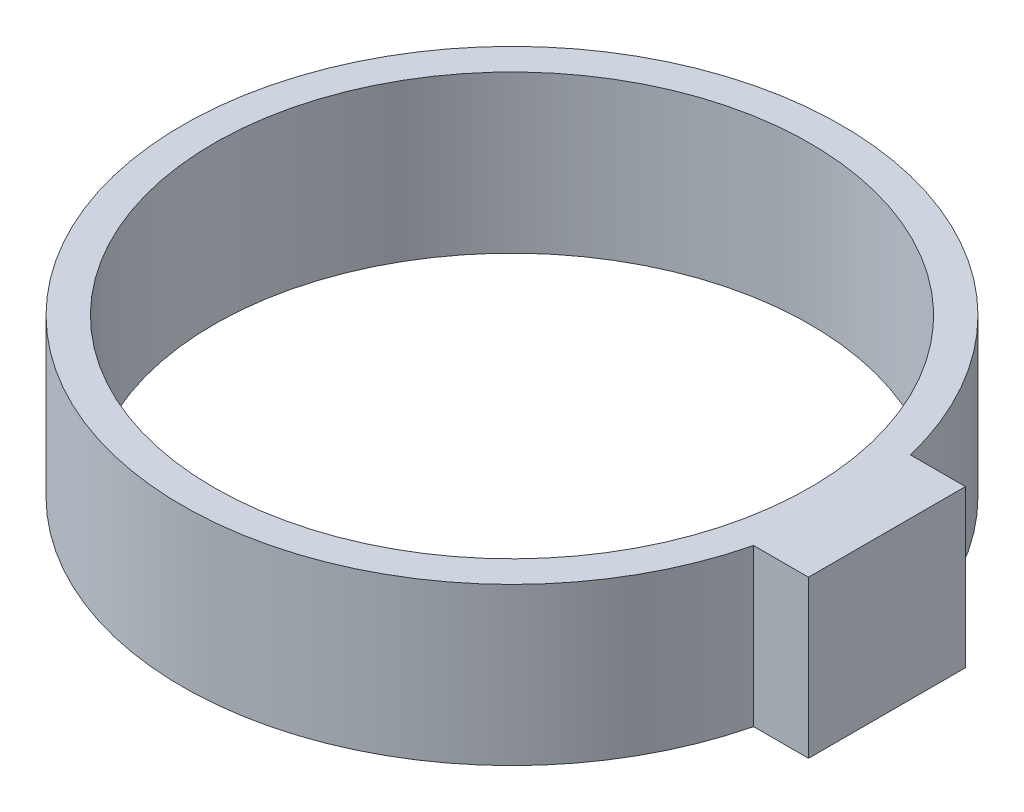
ISO-10303-21;
HEADER;
FILE_DESCRIPTION(('STEP AP214'),'2;1');
FILE_NAME('part.step','',(''),(''),'','','');
FILE_SCHEMA(('AUTOMOTIVE_DESIGN { 1 0 10303 214 1 1 1 1 }'));
ENDSEC;
DATA;
#1=APPLICATION_CONTEXT('core data for automotive mechanical design processes');
#2=APPLICATION_PROTOCOL_DEFINITION('international standard','automotive_design',2000,#1);
#3=PRODUCT_CONTEXT('',#1,'mechanical');
#4=PRODUCT('Part','Part','',(#3));
#5=PRODUCT_RELATED_PRODUCT_CATEGORY('part','',(#4));
#6=PRODUCT_DEFINITION_FORMATION('','',#4);
#7=PRODUCT_DEFINITION_CONTEXT('part definition',#1,'design');
#8=PRODUCT_DEFINITION('design','',#6,#7);
#9=PRODUCT_DEFINITION_SHAPE('','',#8);
#10=(LENGTH_UNIT() NAMED_UNIT(*) SI_UNIT(.MILLI.,.METRE.));
#11=(NAMED_UNIT(*) PLANE_ANGLE_UNIT() SI_UNIT($,.RADIAN.));
#12=(NAMED_UNIT(*) SI_UNIT($,.STERADIAN.) SOLID_ANGLE_UNIT());
#13=UNCERTAINTY_MEASURE_WITH_UNIT(LENGTH_MEASURE(1.E-05),#10,'distance_accuracy_value','');
#14=(GEOMETRIC_REPRESENTATION_CONTEXT(3) GLOBAL_UNCERTAINTY_ASSIGNED_CONTEXT((#13)) GLOBAL_UNIT_ASSIGNED_CONTEXT((#10,
#11,#12)) REPRESENTATION_CONTEXT('',''));
#15=CARTESIAN_POINT('',(0.,0.,0.));
#16=DIRECTION('',(0.,0.,1.));
#17=DIRECTION('',(1.,0.,0.));
#18=AXIS2_PLACEMENT_3D('',#15,#16,#17);
#19=CARTESIAN_POINT('',(0.,10.,0.));
#20=DIRECTION('',(0.,1.,0.));
#21=DIRECTION('',(0.,0.,1.));
#22=AXIS2_PLACEMENT_3D('',#19,#20,#21);
#23=PLANE('',#22);
#24=DIRECTION('',(0.,0.,-1.));
#25=VECTOR('',#24,1.);
#26=CARTESIAN_POINT('',(23.8960780543711,10.,-5.));
#27=LINE('',#26,#25);
#28=CARTESIAN_POINT('',(23.8960780543711,10.,5.));
#29=VERTEX_POINT('',#28);
#30=CARTESIAN_POINT('',(23.8960780543711,10.,-5.));
#31=VERTEX_POINT('',#30);
#32=EDGE_CURVE('E92',#29,#31,#27,.T.);
#33=ORIENTED_EDGE('',*,*,#32,.T.);
#34=DIRECTION('',(-1.,0.,0.));
#35=VECTOR('',#34,1.);
#36=CARTESIAN_POINT('',(20.3960780543711,10.,-5.));
#37=LINE('',#36,#35);
#38=CARTESIAN_POINT('',(20.3960780543711,10.,-5.));
#39=VERTEX_POINT('',#38);
#40=EDGE_CURVE('E87',#31,#39,#37,.T.);
#41=ORIENTED_EDGE('',*,*,#40,.T.);
#42=CARTESIAN_POINT('',(0.,10.,0.));
#43=DIRECTION('',(0.,1.,0.));
#44=DIRECTION('',(0.,0.,1.));
#45=AXIS2_PLACEMENT_3D('',#42,#43,#44);
#46=CIRCLE('',#45,21.);
#47=CARTESIAN_POINT('',(20.3960780543711,10.,5.));
#48=VERTEX_POINT('',#47);
#49=EDGE_CURVE('E90',#39,#48,#46,.T.);
#50=ORIENTED_EDGE('',*,*,#49,.T.);
#51=DIRECTION('',(1.,0.,0.));
#52=VECTOR('',#51,1.);
#53=CARTESIAN_POINT('',(23.8960780543711,10.,5.));
#54=LINE('',#53,#52);
#55=EDGE_CURVE('E57',#48,#29,#54,.T.);
#56=ORIENTED_EDGE('',*,*,#55,.T.);
#57=EDGE_LOOP('',(#33,#41,#50,#56));
#58=FACE_BOUND('',#57,.T.);
#59=CARTESIAN_POINT('',(0.,10.,0.));
#60=DIRECTION('',(0.,1.,0.));
#61=DIRECTION('',(0.,0.,1.));
#62=AXIS2_PLACEMENT_3D('',#59,#60,#61);
#63=CIRCLE('',#62,19.);
#64=CARTESIAN_POINT('',(0.,10.,19.));
#65=VERTEX_POINT('',#64);
#66=EDGE_CURVE('E112',#65,#65,#63,.T.);
#67=ORIENTED_EDGE('',*,*,#66,.F.);
#68=EDGE_LOOP('',(#67));
#69=FACE_BOUND('',#68,.T.);
#70=ADVANCED_FACE('F39',(#58,#69),#23,.T.);
#71=CARTESIAN_POINT('',(0.,0.,0.));
#72=DIRECTION('',(0.,1.,0.));
#73=DIRECTION('',(0.,0.,1.));
#74=AXIS2_PLACEMENT_3D('',#71,#72,#73);
#75=PLANE('',#74);
#76=DIRECTION('',(0.,0.,-1.));
#77=VECTOR('',#76,1.);
#78=CARTESIAN_POINT('',(23.8960780543711,0.,-5.));
#79=LINE('',#78,#77);
#80=CARTESIAN_POINT('',(23.8960780543711,0.,5.));
#81=VERTEX_POINT('',#80);
#82=CARTESIAN_POINT('',(23.8960780543711,0.,-5.));
#83=VERTEX_POINT('',#82);
#84=EDGE_CURVE('E108',#81,#83,#79,.T.);
#85=ORIENTED_EDGE('',*,*,#84,.F.);
#86=DIRECTION('',(1.,0.,0.));
#87=VECTOR('',#86,1.);
#88=CARTESIAN_POINT('',(23.8960780543711,0.,5.));
#89=LINE('',#88,#87);
#90=CARTESIAN_POINT('',(20.3960780543711,0.,5.));
#91=VERTEX_POINT('',#90);
#92=EDGE_CURVE('E80',#91,#81,#89,.T.);
#93=ORIENTED_EDGE('',*,*,#92,.F.);
#94=CARTESIAN_POINT('',(0.,0.,0.));
#95=DIRECTION('',(0.,1.,0.));
#96=DIRECTION('',(0.,0.,1.));
#97=AXIS2_PLACEMENT_3D('',#94,#95,#96);
#98=CIRCLE('',#97,21.);
#99=CARTESIAN_POINT('',(20.3960780543711,0.,-5.));
#100=VERTEX_POINT('',#99);
#101=EDGE_CURVE('E74',#100,#91,#98,.T.);
#102=ORIENTED_EDGE('',*,*,#101,.F.);
#103=DIRECTION('',(-1.,0.,0.));
#104=VECTOR('',#103,1.);
#105=CARTESIAN_POINT('',(20.3960780543711,0.,-5.));
#106=LINE('',#105,#104);
#107=EDGE_CURVE('E97',#83,#100,#106,.T.);
#108=ORIENTED_EDGE('',*,*,#107,.F.);
#109=EDGE_LOOP('',(#85,#93,#102,#108));
#110=FACE_BOUND('',#109,.T.);
#111=CARTESIAN_POINT('',(0.,0.,0.));
#112=DIRECTION('',(0.,1.,0.));
#113=DIRECTION('',(0.,0.,1.));
#114=AXIS2_PLACEMENT_3D('',#111,#112,#113);
#115=CIRCLE('',#114,19.);
#116=CARTESIAN_POINT('',(0.,0.,19.));
#117=VERTEX_POINT('',#116);
#118=EDGE_CURVE('E130',#117,#117,#115,.T.);
#119=ORIENTED_EDGE('',*,*,#118,.T.);
#120=EDGE_LOOP('',(#119));
#121=FACE_BOUND('',#120,.T.);
#122=ADVANCED_FACE('F125',(#110,#121),#75,.F.);
#123=CARTESIAN_POINT('',(23.8960780543711,10.,-5.));
#124=DIRECTION('',(-1.,0.,0.));
#125=DIRECTION('',(0.,0.,1.));
#126=AXIS2_PLACEMENT_3D('',#123,#124,#125);
#127=PLANE('',#126);
#128=ORIENTED_EDGE('',*,*,#84,.T.);
#129=DIRECTION('',(0.,-1.,0.));
#130=VECTOR('',#129,1.);
#131=CARTESIAN_POINT('',(23.8960780543711,10.,-5.));
#132=LINE('',#131,#130);
#133=EDGE_CURVE('E11',#31,#83,#132,.T.);
#134=ORIENTED_EDGE('',*,*,#133,.F.);
#135=ORIENTED_EDGE('',*,*,#32,.F.);
#136=DIRECTION('',(0.,-1.,0.));
#137=VECTOR('',#136,1.);
#138=CARTESIAN_POINT('',(23.8960780543711,10.,5.));
#139=LINE('',#138,#137);
#140=EDGE_CURVE('E104',#29,#81,#139,.T.);
#141=ORIENTED_EDGE('',*,*,#140,.T.);
#142=EDGE_LOOP('',(#128,#134,#135,#141));
#143=FACE_BOUND('',#142,.T.);
#144=ADVANCED_FACE('F41',(#143),#127,.F.);
#145=CARTESIAN_POINT('',(20.3960780543711,10.,-5.));
#146=DIRECTION('',(0.,0.,1.));
#147=DIRECTION('',(1.,0.,0.));
#148=AXIS2_PLACEMENT_3D('',#145,#146,#147);
#149=PLANE('',#148);
#150=ORIENTED_EDGE('',*,*,#107,.T.);
#151=DIRECTION('',(0.,-1.,0.));
#152=VECTOR('',#151,1.);
#153=CARTESIAN_POINT('',(20.3960780543711,10.,-5.));
#154=LINE('',#153,#152);
#155=EDGE_CURVE('E49',#39,#100,#154,.T.);
#156=ORIENTED_EDGE('',*,*,#155,.F.);
#157=ORIENTED_EDGE('',*,*,#40,.F.);
#158=ORIENTED_EDGE('',*,*,#133,.T.);
#159=EDGE_LOOP('',(#150,#156,#157,#158));
#160=FACE_BOUND('',#159,.T.);
#161=ADVANCED_FACE('F96',(#160),#149,.F.);
#162=CARTESIAN_POINT('',(0.,10.,0.));
#163=DIRECTION('',(0.,-1.,0.));
#164=DIRECTION('',(0.,0.,-1.));
#165=AXIS2_PLACEMENT_3D('',#162,#163,#164);
#166=CYLINDRICAL_SURFACE('',#165,21.);
#167=ORIENTED_EDGE('',*,*,#101,.T.);
#168=DIRECTION('',(0.,-1.,0.));
#169=VECTOR('',#168,1.);
#170=CARTESIAN_POINT('',(20.3960780543711,10.,5.));
#171=LINE('',#170,#169);
#172=EDGE_CURVE('E99',#48,#91,#171,.T.);
#173=ORIENTED_EDGE('',*,*,#172,.F.);
#174=ORIENTED_EDGE('',*,*,#49,.F.);
#175=ORIENTED_EDGE('',*,*,#155,.T.);
#176=EDGE_LOOP('',(#167,#173,#174,#175));
#177=FACE_BOUND('',#176,.T.);
#178=ADVANCED_FACE('F100',(#177),#166,.T.);
#179=CARTESIAN_POINT('',(23.8960780543711,10.,5.));
#180=DIRECTION('',(0.,0.,-1.));
#181=DIRECTION('',(-1.,0.,0.));
#182=AXIS2_PLACEMENT_3D('',#179,#180,#181);
#183=PLANE('',#182);
#184=ORIENTED_EDGE('',*,*,#92,.T.);
#185=ORIENTED_EDGE('',*,*,#140,.F.);
#186=ORIENTED_EDGE('',*,*,#55,.F.);
#187=ORIENTED_EDGE('',*,*,#172,.T.);
#188=EDGE_LOOP('',(#184,#185,#186,#187));
#189=FACE_BOUND('',#188,.T.);
#190=ADVANCED_FACE('F122',(#189),#183,.F.);
#191=CARTESIAN_POINT('',(0.,10.,0.));
#192=DIRECTION('',(0.,-1.,0.));
#193=DIRECTION('',(0.,0.,-1.));
#194=AXIS2_PLACEMENT_3D('',#191,#192,#193);
#195=CYLINDRICAL_SURFACE('',#194,19.);
#196=ORIENTED_EDGE('',*,*,#66,.T.);
#197=EDGE_LOOP('',(#196));
#198=FACE_BOUND('',#197,.T.);
#199=ORIENTED_EDGE('',*,*,#118,.F.);
#200=EDGE_LOOP('',(#199));
#201=FACE_BOUND('',#200,.T.);
#202=ADVANCED_FACE('F138',(#198,#201),#195,.F.);
#203=CLOSED_SHELL('',(#70,#122,#144,#161,#178,#190,#202));
#204=MANIFOLD_SOLID_BREP('B2',#203);
#205=ADVANCED_BREP_SHAPE_REPRESENTATION('',(#18,#204),#14);
#206=SHAPE_DEFINITION_REPRESENTATION(#9,#205);
ENDSEC;
END-ISO-10303-21;
